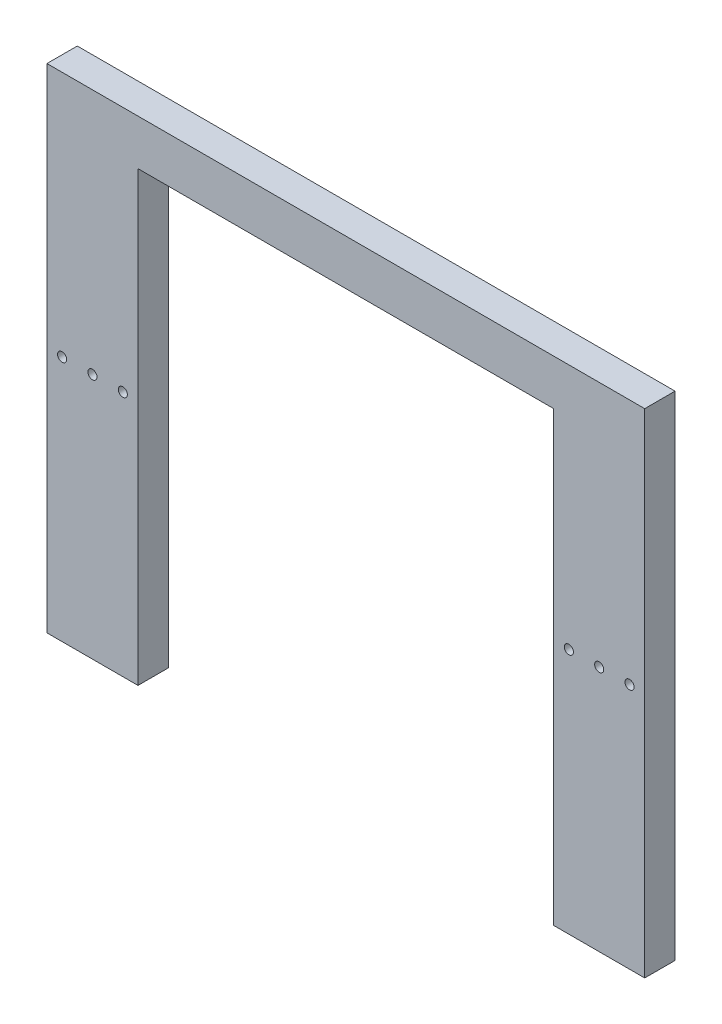
ISO-10303-21;
HEADER;
FILE_DESCRIPTION(('STEP AP214'),'2;1');
FILE_NAME('part.step','',(''),(''),'','','');
FILE_SCHEMA(('AUTOMOTIVE_DESIGN { 1 0 10303 214 1 1 1 1 }'));
ENDSEC;
DATA;
#1=APPLICATION_CONTEXT('core data for automotive mechanical design processes');
#2=APPLICATION_PROTOCOL_DEFINITION('international standard','automotive_design',2000,#1);
#3=PRODUCT_CONTEXT('',#1,'mechanical');
#4=PRODUCT('Part','Part','',(#3));
#5=PRODUCT_RELATED_PRODUCT_CATEGORY('part','',(#4));
#6=PRODUCT_DEFINITION_FORMATION('','',#4);
#7=PRODUCT_DEFINITION_CONTEXT('part definition',#1,'design');
#8=PRODUCT_DEFINITION('design','',#6,#7);
#9=PRODUCT_DEFINITION_SHAPE('','',#8);
#10=(LENGTH_UNIT() NAMED_UNIT(*) SI_UNIT(.MILLI.,.METRE.));
#11=(NAMED_UNIT(*) PLANE_ANGLE_UNIT() SI_UNIT($,.RADIAN.));
#12=(NAMED_UNIT(*) SI_UNIT($,.STERADIAN.) SOLID_ANGLE_UNIT());
#13=UNCERTAINTY_MEASURE_WITH_UNIT(LENGTH_MEASURE(1.E-05),#10,'distance_accuracy_value','');
#14=(GEOMETRIC_REPRESENTATION_CONTEXT(3) GLOBAL_UNCERTAINTY_ASSIGNED_CONTEXT((#13)) GLOBAL_UNIT_ASSIGNED_CONTEXT((#10,
#11,#12)) REPRESENTATION_CONTEXT('',''));
#15=CARTESIAN_POINT('',(0.,0.,0.));
#16=DIRECTION('',(0.,0.,1.));
#17=DIRECTION('',(1.,0.,0.));
#18=AXIS2_PLACEMENT_3D('',#15,#16,#17);
#19=CARTESIAN_POINT('',(0.,0.,20.));
#20=DIRECTION('',(1.,0.,0.));
#21=DIRECTION('',(0.,1.,0.));
#22=AXIS2_PLACEMENT_3D('',#19,#20,#21);
#23=PLANE('',#22);
#24=DIRECTION('',(0.,0.,1.));
#25=VECTOR('',#24,1.);
#26=CARTESIAN_POINT('',(0.,-30.,-275.637443029789));
#27=LINE('',#26,#25);
#28=CARTESIAN_POINT('',(0.,-30.,0.));
#29=VERTEX_POINT('',#28);
#30=CARTESIAN_POINT('',(0.,-30.,20.));
#31=VERTEX_POINT('',#30);
#32=EDGE_CURVE('E47',#29,#31,#27,.T.);
#33=ORIENTED_EDGE('',*,*,#32,.F.);
#34=DIRECTION('',(0.,-1.,0.));
#35=VECTOR('',#34,1.);
#36=CARTESIAN_POINT('',(0.,0.,0.));
#37=LINE('',#36,#35);
#38=CARTESIAN_POINT('',(0.,-325.,0.));
#39=VERTEX_POINT('',#38);
#40=EDGE_CURVE('E158',#29,#39,#37,.T.);
#41=ORIENTED_EDGE('',*,*,#40,.T.);
#42=DIRECTION('',(0.,0.,-1.));
#43=VECTOR('',#42,1.);
#44=CARTESIAN_POINT('',(0.,-325.,20.));
#45=LINE('',#44,#43);
#46=CARTESIAN_POINT('',(0.,-325.,20.));
#47=VERTEX_POINT('',#46);
#48=EDGE_CURVE('E11',#47,#39,#45,.T.);
#49=ORIENTED_EDGE('',*,*,#48,.F.);
#50=DIRECTION('',(0.,-1.,0.));
#51=VECTOR('',#50,1.);
#52=CARTESIAN_POINT('',(0.,0.,20.));
#53=LINE('',#52,#51);
#54=EDGE_CURVE('E76',#31,#47,#53,.T.);
#55=ORIENTED_EDGE('',*,*,#54,.F.);
#56=EDGE_LOOP('',(#33,#41,#49,#55));
#57=FACE_BOUND('',#56,.T.);
#58=ADVANCED_FACE('F33',(#57),#23,.F.);
#59=CARTESIAN_POINT('',(0.,-325.,20.));
#60=DIRECTION('',(0.,1.,0.));
#61=DIRECTION('',(0.,0.,1.));
#62=AXIS2_PLACEMENT_3D('',#59,#60,#61);
#63=PLANE('',#62);
#64=DIRECTION('',(1.,0.,0.));
#65=VECTOR('',#64,1.);
#66=CARTESIAN_POINT('',(0.,-325.,0.));
#67=LINE('',#66,#65);
#68=CARTESIAN_POINT('',(60.,-325.,0.));
#69=VERTEX_POINT('',#68);
#70=EDGE_CURVE('E178',#39,#69,#67,.T.);
#71=ORIENTED_EDGE('',*,*,#70,.T.);
#72=DIRECTION('',(0.,0.,-1.));
#73=VECTOR('',#72,1.);
#74=CARTESIAN_POINT('',(60.,-325.,20.));
#75=LINE('',#74,#73);
#76=CARTESIAN_POINT('',(60.,-325.,20.));
#77=VERTEX_POINT('',#76);
#78=EDGE_CURVE('E40',#77,#69,#75,.T.);
#79=ORIENTED_EDGE('',*,*,#78,.F.);
#80=DIRECTION('',(1.,0.,0.));
#81=VECTOR('',#80,1.);
#82=CARTESIAN_POINT('',(0.,-325.,20.));
#83=LINE('',#82,#81);
#84=EDGE_CURVE('E174',#47,#77,#83,.T.);
#85=ORIENTED_EDGE('',*,*,#84,.F.);
#86=ORIENTED_EDGE('',*,*,#48,.T.);
#87=EDGE_LOOP('',(#71,#79,#85,#86));
#88=FACE_BOUND('',#87,.T.);
#89=ADVANCED_FACE('F200',(#88),#63,.F.);
#90=CARTESIAN_POINT('',(60.,0.,20.));
#91=DIRECTION('',(-1.,0.,0.));
#92=DIRECTION('',(0.,-1.,0.));
#93=AXIS2_PLACEMENT_3D('',#90,#91,#92);
#94=PLANE('',#93);
#95=DIRECTION('',(0.,1.,0.));
#96=VECTOR('',#95,1.);
#97=CARTESIAN_POINT('',(60.,0.,0.));
#98=LINE('',#97,#96);
#99=CARTESIAN_POINT('',(60.,0.,0.));
#100=VERTEX_POINT('',#99);
#101=EDGE_CURVE('E72',#69,#100,#98,.T.);
#102=ORIENTED_EDGE('',*,*,#101,.T.);
#103=DIRECTION('',(0.,0.,-1.));
#104=VECTOR('',#103,1.);
#105=CARTESIAN_POINT('',(60.,0.,20.));
#106=LINE('',#105,#104);
#107=CARTESIAN_POINT('',(60.,0.,20.));
#108=VERTEX_POINT('',#107);
#109=EDGE_CURVE('E111',#108,#100,#106,.T.);
#110=ORIENTED_EDGE('',*,*,#109,.F.);
#111=DIRECTION('',(0.,1.,0.));
#112=VECTOR('',#111,1.);
#113=CARTESIAN_POINT('',(60.,0.,20.));
#114=LINE('',#113,#112);
#115=EDGE_CURVE('E56',#77,#108,#114,.T.);
#116=ORIENTED_EDGE('',*,*,#115,.F.);
#117=ORIENTED_EDGE('',*,*,#78,.T.);
#118=EDGE_LOOP('',(#102,#110,#116,#117));
#119=FACE_BOUND('',#118,.T.);
#120=ADVANCED_FACE('F183',(#119),#94,.F.);
#121=CARTESIAN_POINT('',(0.,0.,20.));
#122=DIRECTION('',(0.,-1.,0.));
#123=DIRECTION('',(0.,0.,-1.));
#124=AXIS2_PLACEMENT_3D('',#121,#122,#123);
#125=PLANE('',#124);
#126=DIRECTION('',(-1.,0.,0.));
#127=VECTOR('',#126,1.);
#128=CARTESIAN_POINT('',(0.,0.,0.));
#129=LINE('',#128,#127);
#130=CARTESIAN_POINT('',(-334.,0.,0.));
#131=VERTEX_POINT('',#130);
#132=EDGE_CURVE('E117',#100,#131,#129,.T.);
#133=ORIENTED_EDGE('',*,*,#132,.T.);
#134=DIRECTION('',(0.,0.,-1.));
#135=VECTOR('',#134,1.);
#136=CARTESIAN_POINT('',(-334.,0.,20.));
#137=LINE('',#136,#135);
#138=CARTESIAN_POINT('',(-334.,0.,20.));
#139=VERTEX_POINT('',#138);
#140=EDGE_CURVE('E114',#139,#131,#137,.T.);
#141=ORIENTED_EDGE('',*,*,#140,.F.);
#142=DIRECTION('',(-1.,0.,0.));
#143=VECTOR('',#142,1.);
#144=CARTESIAN_POINT('',(0.,0.,20.));
#145=LINE('',#144,#143);
#146=EDGE_CURVE('E103',#108,#139,#145,.T.);
#147=ORIENTED_EDGE('',*,*,#146,.F.);
#148=ORIENTED_EDGE('',*,*,#109,.T.);
#149=EDGE_LOOP('',(#133,#141,#147,#148));
#150=FACE_BOUND('',#149,.T.);
#151=ADVANCED_FACE('F115',(#150),#125,.F.);
#152=CARTESIAN_POINT('',(0.,0.,20.));
#153=DIRECTION('',(0.,0.,1.));
#154=DIRECTION('',(1.,0.,0.));
#155=AXIS2_PLACEMENT_3D('',#152,#153,#154);
#156=PLANE('',#155);
#157=CARTESIAN_POINT('',(50.,-162.5,20.));
#158=DIRECTION('',(0.,0.,1.));
#159=DIRECTION('',(1.,0.,0.));
#160=AXIS2_PLACEMENT_3D('',#157,#158,#159);
#161=CIRCLE('',#160,3.);
#162=CARTESIAN_POINT('',(53.,-162.5,20.));
#163=VERTEX_POINT('',#162);
#164=EDGE_CURVE('E159',#163,#163,#161,.T.);
#165=ORIENTED_EDGE('',*,*,#164,.F.);
#166=EDGE_LOOP('',(#165));
#167=FACE_BOUND('',#166,.T.);
#168=CARTESIAN_POINT('',(10.,-162.5,20.));
#169=DIRECTION('',(0.,0.,1.));
#170=DIRECTION('',(1.,0.,0.));
#171=AXIS2_PLACEMENT_3D('',#168,#169,#170);
#172=CIRCLE('',#171,3.);
#173=CARTESIAN_POINT('',(13.,-162.5,20.));
#174=VERTEX_POINT('',#173);
#175=EDGE_CURVE('E165',#174,#174,#172,.T.);
#176=ORIENTED_EDGE('',*,*,#175,.F.);
#177=EDGE_LOOP('',(#176));
#178=FACE_BOUND('',#177,.T.);
#179=CARTESIAN_POINT('',(30.,-162.5,20.));
#180=DIRECTION('',(0.,0.,1.));
#181=DIRECTION('',(1.,0.,0.));
#182=AXIS2_PLACEMENT_3D('',#179,#180,#181);
#183=CIRCLE('',#182,3.);
#184=CARTESIAN_POINT('',(33.,-162.5,20.));
#185=VERTEX_POINT('',#184);
#186=EDGE_CURVE('E154',#185,#185,#183,.T.);
#187=ORIENTED_EDGE('',*,*,#186,.F.);
#188=EDGE_LOOP('',(#187));
#189=FACE_BOUND('',#188,.T.);
#190=ORIENTED_EDGE('',*,*,#146,.T.);
#191=DIRECTION('',(0.,-1.,0.));
#192=VECTOR('',#191,1.);
#193=CARTESIAN_POINT('',(-334.,0.,20.));
#194=LINE('',#193,#192);
#195=CARTESIAN_POINT('',(-334.,-325.,20.));
#196=VERTEX_POINT('',#195);
#197=EDGE_CURVE('E108',#139,#196,#194,.T.);
#198=ORIENTED_EDGE('',*,*,#197,.T.);
#199=DIRECTION('',(1.,0.,0.));
#200=VECTOR('',#199,1.);
#201=CARTESIAN_POINT('',(-274.,-325.,20.));
#202=LINE('',#201,#200);
#203=CARTESIAN_POINT('',(-274.,-325.,20.));
#204=VERTEX_POINT('',#203);
#205=EDGE_CURVE('E126',#196,#204,#202,.T.);
#206=ORIENTED_EDGE('',*,*,#205,.T.);
#207=DIRECTION('',(0.,1.,0.));
#208=VECTOR('',#207,1.);
#209=CARTESIAN_POINT('',(-274.,0.,20.));
#210=LINE('',#209,#208);
#211=CARTESIAN_POINT('',(-274.,-30.,20.));
#212=VERTEX_POINT('',#211);
#213=EDGE_CURVE('E127',#204,#212,#210,.T.);
#214=ORIENTED_EDGE('',*,*,#213,.T.);
#215=DIRECTION('',(1.,0.,0.));
#216=VECTOR('',#215,1.);
#217=CARTESIAN_POINT('',(-274.,-30.,20.));
#218=LINE('',#217,#216);
#219=EDGE_CURVE('E120',#212,#31,#218,.T.);
#220=ORIENTED_EDGE('',*,*,#219,.T.);
#221=ORIENTED_EDGE('',*,*,#54,.T.);
#222=ORIENTED_EDGE('',*,*,#84,.T.);
#223=ORIENTED_EDGE('',*,*,#115,.T.);
#224=EDGE_LOOP('',(#190,#198,#206,#214,#220,#221,#222,#223));
#225=FACE_BOUND('',#224,.T.);
#226=CARTESIAN_POINT('',(-324.,-162.5,20.));
#227=DIRECTION('',(0.,0.,1.));
#228=DIRECTION('',(1.,0.,0.));
#229=AXIS2_PLACEMENT_3D('',#226,#227,#228);
#230=CIRCLE('',#229,2.99999999999999);
#231=CARTESIAN_POINT('',(-321.,-162.5,20.));
#232=VERTEX_POINT('',#231);
#233=EDGE_CURVE('E274',#232,#232,#230,.T.);
#234=ORIENTED_EDGE('',*,*,#233,.F.);
#235=EDGE_LOOP('',(#234));
#236=FACE_BOUND('',#235,.T.);
#237=CARTESIAN_POINT('',(-304.,-162.5,20.));
#238=DIRECTION('',(0.,0.,1.));
#239=DIRECTION('',(1.,0.,0.));
#240=AXIS2_PLACEMENT_3D('',#237,#238,#239);
#241=CIRCLE('',#240,2.99999999999999);
#242=CARTESIAN_POINT('',(-301.,-162.5,20.));
#243=VERTEX_POINT('',#242);
#244=EDGE_CURVE('E282',#243,#243,#241,.T.);
#245=ORIENTED_EDGE('',*,*,#244,.F.);
#246=EDGE_LOOP('',(#245));
#247=FACE_BOUND('',#246,.T.);
#248=CARTESIAN_POINT('',(-284.,-162.5,20.));
#249=DIRECTION('',(0.,0.,1.));
#250=DIRECTION('',(1.,0.,0.));
#251=AXIS2_PLACEMENT_3D('',#248,#249,#250);
#252=CIRCLE('',#251,2.99999999999999);
#253=CARTESIAN_POINT('',(-281.,-162.5,20.));
#254=VERTEX_POINT('',#253);
#255=EDGE_CURVE('E287',#254,#254,#252,.T.);
#256=ORIENTED_EDGE('',*,*,#255,.F.);
#257=EDGE_LOOP('',(#256));
#258=FACE_BOUND('',#257,.T.);
#259=ADVANCED_FACE('F105',(#167,#178,#189,#225,#236,#247,#258),#156,.T.);
#260=CARTESIAN_POINT('',(0.,0.,0.));
#261=DIRECTION('',(0.,0.,1.));
#262=DIRECTION('',(1.,0.,0.));
#263=AXIS2_PLACEMENT_3D('',#260,#261,#262);
#264=PLANE('',#263);
#265=ORIENTED_EDGE('',*,*,#40,.F.);
#266=DIRECTION('',(1.,0.,0.));
#267=VECTOR('',#266,1.);
#268=CARTESIAN_POINT('',(-274.,-30.,0.));
#269=LINE('',#268,#267);
#270=CARTESIAN_POINT('',(-274.,-30.,0.));
#271=VERTEX_POINT('',#270);
#272=EDGE_CURVE('E147',#271,#29,#269,.T.);
#273=ORIENTED_EDGE('',*,*,#272,.F.);
#274=DIRECTION('',(0.,1.,0.));
#275=VECTOR('',#274,1.);
#276=CARTESIAN_POINT('',(-274.,0.,0.));
#277=LINE('',#276,#275);
#278=CARTESIAN_POINT('',(-274.,-325.,0.));
#279=VERTEX_POINT('',#278);
#280=EDGE_CURVE('E136',#279,#271,#277,.T.);
#281=ORIENTED_EDGE('',*,*,#280,.F.);
#282=DIRECTION('',(1.,0.,0.));
#283=VECTOR('',#282,1.);
#284=CARTESIAN_POINT('',(-274.,-325.,0.));
#285=LINE('',#284,#283);
#286=CARTESIAN_POINT('',(-334.,-325.,0.));
#287=VERTEX_POINT('',#286);
#288=EDGE_CURVE('E132',#287,#279,#285,.T.);
#289=ORIENTED_EDGE('',*,*,#288,.F.);
#290=DIRECTION('',(0.,-1.,0.));
#291=VECTOR('',#290,1.);
#292=CARTESIAN_POINT('',(-334.,0.,0.));
#293=LINE('',#292,#291);
#294=EDGE_CURVE('E139',#131,#287,#293,.T.);
#295=ORIENTED_EDGE('',*,*,#294,.F.);
#296=ORIENTED_EDGE('',*,*,#132,.F.);
#297=ORIENTED_EDGE('',*,*,#101,.F.);
#298=ORIENTED_EDGE('',*,*,#70,.F.);
#299=EDGE_LOOP('',(#265,#273,#281,#289,#295,#296,#297,#298));
#300=FACE_BOUND('',#299,.T.);
#301=ADVANCED_FACE('F187',(#300),#264,.F.);
#302=CARTESIAN_POINT('',(30.,-162.5,10.));
#303=DIRECTION('',(0.,0.,1.));
#304=DIRECTION('',(1.,0.,0.));
#305=AXIS2_PLACEMENT_3D('',#302,#303,#304);
#306=CYLINDRICAL_SURFACE('',#305,3.);
#307=CARTESIAN_POINT('',(30.,-162.5,10.));
#308=DIRECTION('',(0.,0.,1.));
#309=DIRECTION('',(1.,0.,0.));
#310=AXIS2_PLACEMENT_3D('',#307,#308,#309);
#311=CIRCLE('',#310,3.);
#312=CARTESIAN_POINT('',(33.,-162.5,10.));
#313=VERTEX_POINT('',#312);
#314=EDGE_CURVE('E168',#313,#313,#311,.T.);
#315=ORIENTED_EDGE('',*,*,#314,.F.);
#316=EDGE_LOOP('',(#315));
#317=FACE_BOUND('',#316,.T.);
#318=ORIENTED_EDGE('',*,*,#186,.T.);
#319=EDGE_LOOP('',(#318));
#320=FACE_BOUND('',#319,.T.);
#321=ADVANCED_FACE('F212',(#317,#320),#306,.F.);
#322=CARTESIAN_POINT('',(30.,-162.5,10.));
#323=DIRECTION('',(0.,0.,1.));
#324=DIRECTION('',(1.,0.,0.));
#325=AXIS2_PLACEMENT_3D('',#322,#323,#324);
#326=PLANE('',#325);
#327=ORIENTED_EDGE('',*,*,#314,.T.);
#328=EDGE_LOOP('',(#327));
#329=FACE_BOUND('',#328,.T.);
#330=ADVANCED_FACE('F218',(#329),#326,.T.);
#331=CARTESIAN_POINT('',(10.,-162.5,10.));
#332=DIRECTION('',(0.,0.,1.));
#333=DIRECTION('',(1.,0.,0.));
#334=AXIS2_PLACEMENT_3D('',#331,#332,#333);
#335=CYLINDRICAL_SURFACE('',#334,3.);
#336=CARTESIAN_POINT('',(10.,-162.5,10.));
#337=DIRECTION('',(0.,0.,1.));
#338=DIRECTION('',(1.,0.,0.));
#339=AXIS2_PLACEMENT_3D('',#336,#337,#338);
#340=CIRCLE('',#339,3.);
#341=CARTESIAN_POINT('',(13.,-162.5,10.));
#342=VERTEX_POINT('',#341);
#343=EDGE_CURVE('E162',#342,#342,#340,.T.);
#344=ORIENTED_EDGE('',*,*,#343,.F.);
#345=EDGE_LOOP('',(#344));
#346=FACE_BOUND('',#345,.T.);
#347=ORIENTED_EDGE('',*,*,#175,.T.);
#348=EDGE_LOOP('',(#347));
#349=FACE_BOUND('',#348,.T.);
#350=ADVANCED_FACE('F222',(#346,#349),#335,.F.);
#351=CARTESIAN_POINT('',(10.,-162.5,10.));
#352=DIRECTION('',(0.,0.,1.));
#353=DIRECTION('',(1.,0.,0.));
#354=AXIS2_PLACEMENT_3D('',#351,#352,#353);
#355=PLANE('',#354);
#356=ORIENTED_EDGE('',*,*,#343,.T.);
#357=EDGE_LOOP('',(#356));
#358=FACE_BOUND('',#357,.T.);
#359=ADVANCED_FACE('F226',(#358),#355,.T.);
#360=CARTESIAN_POINT('',(50.,-162.5,10.));
#361=DIRECTION('',(0.,0.,1.));
#362=DIRECTION('',(1.,0.,0.));
#363=AXIS2_PLACEMENT_3D('',#360,#361,#362);
#364=CYLINDRICAL_SURFACE('',#363,3.);
#365=CARTESIAN_POINT('',(50.,-162.5,10.));
#366=DIRECTION('',(0.,0.,1.));
#367=DIRECTION('',(1.,0.,0.));
#368=AXIS2_PLACEMENT_3D('',#365,#366,#367);
#369=CIRCLE('',#368,3.);
#370=CARTESIAN_POINT('',(53.,-162.5,10.));
#371=VERTEX_POINT('',#370);
#372=EDGE_CURVE('E155',#371,#371,#369,.T.);
#373=ORIENTED_EDGE('',*,*,#372,.F.);
#374=EDGE_LOOP('',(#373));
#375=FACE_BOUND('',#374,.T.);
#376=ORIENTED_EDGE('',*,*,#164,.T.);
#377=EDGE_LOOP('',(#376));
#378=FACE_BOUND('',#377,.T.);
#379=ADVANCED_FACE('F230',(#375,#378),#364,.F.);
#380=CARTESIAN_POINT('',(50.,-162.5,10.));
#381=DIRECTION('',(0.,0.,1.));
#382=DIRECTION('',(1.,0.,0.));
#383=AXIS2_PLACEMENT_3D('',#380,#381,#382);
#384=PLANE('',#383);
#385=ORIENTED_EDGE('',*,*,#372,.T.);
#386=EDGE_LOOP('',(#385));
#387=FACE_BOUND('',#386,.T.);
#388=ADVANCED_FACE('F234',(#387),#384,.T.);
#389=CARTESIAN_POINT('',(-274.,-30.,-275.637443029789));
#390=DIRECTION('',(0.,-1.,0.));
#391=DIRECTION('',(0.,0.,-1.));
#392=AXIS2_PLACEMENT_3D('',#389,#390,#391);
#393=PLANE('',#392);
#394=DIRECTION('',(0.,0.,1.));
#395=VECTOR('',#394,1.);
#396=CARTESIAN_POINT('',(-274.,-30.,-275.637443029789));
#397=LINE('',#396,#395);
#398=EDGE_CURVE('E151',#271,#212,#397,.T.);
#399=ORIENTED_EDGE('',*,*,#398,.F.);
#400=ORIENTED_EDGE('',*,*,#272,.T.);
#401=ORIENTED_EDGE('',*,*,#32,.T.);
#402=ORIENTED_EDGE('',*,*,#219,.F.);
#403=EDGE_LOOP('',(#399,#400,#401,#402));
#404=FACE_BOUND('',#403,.T.);
#405=ADVANCED_FACE('F198',(#404),#393,.T.);
#406=CARTESIAN_POINT('',(-274.,0.,20.));
#407=DIRECTION('',(-1.,0.,0.));
#408=DIRECTION('',(0.,-1.,0.));
#409=AXIS2_PLACEMENT_3D('',#406,#407,#408);
#410=PLANE('',#409);
#411=ORIENTED_EDGE('',*,*,#280,.T.);
#412=ORIENTED_EDGE('',*,*,#398,.T.);
#413=ORIENTED_EDGE('',*,*,#213,.F.);
#414=DIRECTION('',(0.,0.,-1.));
#415=VECTOR('',#414,1.);
#416=CARTESIAN_POINT('',(-274.,-325.,20.));
#417=LINE('',#416,#415);
#418=EDGE_CURVE('E129',#204,#279,#417,.T.);
#419=ORIENTED_EDGE('',*,*,#418,.T.);
#420=EDGE_LOOP('',(#411,#412,#413,#419));
#421=FACE_BOUND('',#420,.T.);
#422=ADVANCED_FACE('F195',(#421),#410,.F.);
#423=CARTESIAN_POINT('',(-334.,0.,20.));
#424=DIRECTION('',(1.,0.,0.));
#425=DIRECTION('',(0.,1.,0.));
#426=AXIS2_PLACEMENT_3D('',#423,#424,#425);
#427=PLANE('',#426);
#428=ORIENTED_EDGE('',*,*,#294,.T.);
#429=DIRECTION('',(0.,0.,-1.));
#430=VECTOR('',#429,1.);
#431=CARTESIAN_POINT('',(-334.,-325.,20.));
#432=LINE('',#431,#430);
#433=EDGE_CURVE('E121',#196,#287,#432,.T.);
#434=ORIENTED_EDGE('',*,*,#433,.F.);
#435=ORIENTED_EDGE('',*,*,#197,.F.);
#436=ORIENTED_EDGE('',*,*,#140,.T.);
#437=EDGE_LOOP('',(#428,#434,#435,#436));
#438=FACE_BOUND('',#437,.T.);
#439=ADVANCED_FACE('F123',(#438),#427,.F.);
#440=CARTESIAN_POINT('',(-274.,-325.,20.));
#441=DIRECTION('',(0.,1.,0.));
#442=DIRECTION('',(0.,0.,1.));
#443=AXIS2_PLACEMENT_3D('',#440,#441,#442);
#444=PLANE('',#443);
#445=ORIENTED_EDGE('',*,*,#288,.T.);
#446=ORIENTED_EDGE('',*,*,#418,.F.);
#447=ORIENTED_EDGE('',*,*,#205,.F.);
#448=ORIENTED_EDGE('',*,*,#433,.T.);
#449=EDGE_LOOP('',(#445,#446,#447,#448));
#450=FACE_BOUND('',#449,.T.);
#451=ADVANCED_FACE('F191',(#450),#444,.F.);
#452=CARTESIAN_POINT('',(-284.,-162.5,10.));
#453=DIRECTION('',(0.,0.,1.));
#454=DIRECTION('',(1.,0.,0.));
#455=AXIS2_PLACEMENT_3D('',#452,#453,#454);
#456=CYLINDRICAL_SURFACE('',#455,2.99999999999999);
#457=CARTESIAN_POINT('',(-284.,-162.5,10.));
#458=DIRECTION('',(0.,0.,1.));
#459=DIRECTION('',(1.,0.,0.));
#460=AXIS2_PLACEMENT_3D('',#457,#458,#459);
#461=CIRCLE('',#460,2.99999999999999);
#462=CARTESIAN_POINT('',(-281.,-162.5,10.));
#463=VERTEX_POINT('',#462);
#464=EDGE_CURVE('E285',#463,#463,#461,.T.);
#465=ORIENTED_EDGE('',*,*,#464,.F.);
#466=EDGE_LOOP('',(#465));
#467=FACE_BOUND('',#466,.T.);
#468=ORIENTED_EDGE('',*,*,#255,.T.);
#469=EDGE_LOOP('',(#468));
#470=FACE_BOUND('',#469,.T.);
#471=ADVANCED_FACE('F247',(#467,#470),#456,.F.);
#472=CARTESIAN_POINT('',(-284.,-162.5,10.));
#473=DIRECTION('',(0.,0.,1.));
#474=DIRECTION('',(1.,0.,0.));
#475=AXIS2_PLACEMENT_3D('',#472,#473,#474);
#476=PLANE('',#475);
#477=ORIENTED_EDGE('',*,*,#464,.T.);
#478=EDGE_LOOP('',(#477));
#479=FACE_BOUND('',#478,.T.);
#480=ADVANCED_FACE('F250',(#479),#476,.T.);
#481=CARTESIAN_POINT('',(-304.,-162.5,10.));
#482=DIRECTION('',(0.,0.,1.));
#483=DIRECTION('',(1.,0.,0.));
#484=AXIS2_PLACEMENT_3D('',#481,#482,#483);
#485=CYLINDRICAL_SURFACE('',#484,2.99999999999999);
#486=CARTESIAN_POINT('',(-304.,-162.5,10.));
#487=DIRECTION('',(0.,0.,1.));
#488=DIRECTION('',(1.,0.,0.));
#489=AXIS2_PLACEMENT_3D('',#486,#487,#488);
#490=CIRCLE('',#489,2.99999999999999);
#491=CARTESIAN_POINT('',(-301.,-162.5,10.));
#492=VERTEX_POINT('',#491);
#493=EDGE_CURVE('E277',#492,#492,#490,.T.);
#494=ORIENTED_EDGE('',*,*,#493,.F.);
#495=EDGE_LOOP('',(#494));
#496=FACE_BOUND('',#495,.T.);
#497=ORIENTED_EDGE('',*,*,#244,.T.);
#498=EDGE_LOOP('',(#497));
#499=FACE_BOUND('',#498,.T.);
#500=ADVANCED_FACE('F254',(#496,#499),#485,.F.);
#501=CARTESIAN_POINT('',(-304.,-162.5,10.));
#502=DIRECTION('',(0.,0.,1.));
#503=DIRECTION('',(1.,0.,0.));
#504=AXIS2_PLACEMENT_3D('',#501,#502,#503);
#505=PLANE('',#504);
#506=ORIENTED_EDGE('',*,*,#493,.T.);
#507=EDGE_LOOP('',(#506));
#508=FACE_BOUND('',#507,.T.);
#509=ADVANCED_FACE('F258',(#508),#505,.T.);
#510=CARTESIAN_POINT('',(-324.,-162.5,10.));
#511=DIRECTION('',(0.,0.,1.));
#512=DIRECTION('',(1.,0.,0.));
#513=AXIS2_PLACEMENT_3D('',#510,#511,#512);
#514=CYLINDRICAL_SURFACE('',#513,2.99999999999999);
#515=CARTESIAN_POINT('',(-324.,-162.5,10.));
#516=DIRECTION('',(0.,0.,1.));
#517=DIRECTION('',(1.,0.,0.));
#518=AXIS2_PLACEMENT_3D('',#515,#516,#517);
#519=CIRCLE('',#518,2.99999999999999);
#520=CARTESIAN_POINT('',(-321.,-162.5,10.));
#521=VERTEX_POINT('',#520);
#522=EDGE_CURVE('E140',#521,#521,#519,.T.);
#523=ORIENTED_EDGE('',*,*,#522,.F.);
#524=EDGE_LOOP('',(#523));
#525=FACE_BOUND('',#524,.T.);
#526=ORIENTED_EDGE('',*,*,#233,.T.);
#527=EDGE_LOOP('',(#526));
#528=FACE_BOUND('',#527,.T.);
#529=ADVANCED_FACE('F262',(#525,#528),#514,.F.);
#530=CARTESIAN_POINT('',(-324.,-162.5,10.));
#531=DIRECTION('',(0.,0.,1.));
#532=DIRECTION('',(1.,0.,0.));
#533=AXIS2_PLACEMENT_3D('',#530,#531,#532);
#534=PLANE('',#533);
#535=ORIENTED_EDGE('',*,*,#522,.T.);
#536=EDGE_LOOP('',(#535));
#537=FACE_BOUND('',#536,.T.);
#538=ADVANCED_FACE('F266',(#537),#534,.T.);
#539=CLOSED_SHELL('',(#58,#89,#120,#151,#259,#301,#321,#330,#350,#359,#379,#388,#405,#422,#439,
#451,#471,#480,#500,#509,#529,#538));
#540=MANIFOLD_SOLID_BREP('B2',#539);
#541=ADVANCED_BREP_SHAPE_REPRESENTATION('',(#18,#540),#14);
#542=SHAPE_DEFINITION_REPRESENTATION(#9,#541);
ENDSEC;
END-ISO-10303-21;
